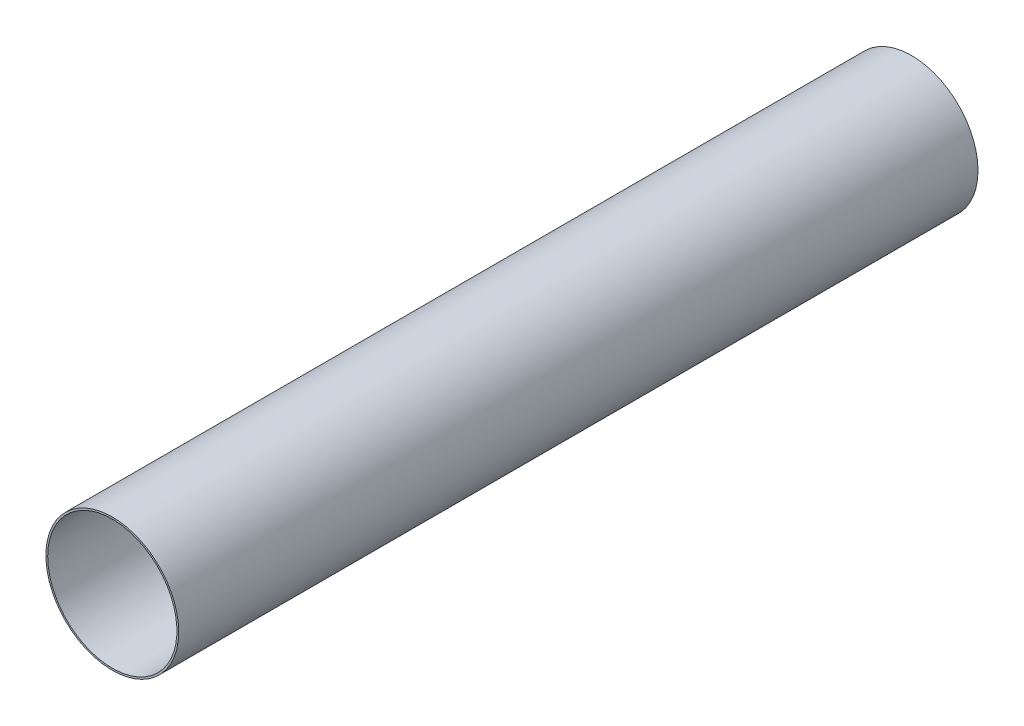
ISO-10303-21;
HEADER;
FILE_DESCRIPTION(('STEP AP214'),'2;1');
FILE_NAME('part.step','',(''),(''),'','','');
FILE_SCHEMA(('AUTOMOTIVE_DESIGN { 1 0 10303 214 1 1 1 1 }'));
ENDSEC;
DATA;
#1=APPLICATION_CONTEXT('core data for automotive mechanical design processes');
#2=APPLICATION_PROTOCOL_DEFINITION('international standard','automotive_design',2000,#1);
#3=PRODUCT_CONTEXT('',#1,'mechanical');
#4=PRODUCT('Part','Part','',(#3));
#5=PRODUCT_RELATED_PRODUCT_CATEGORY('part','',(#4));
#6=PRODUCT_DEFINITION_FORMATION('','',#4);
#7=PRODUCT_DEFINITION_CONTEXT('part definition',#1,'design');
#8=PRODUCT_DEFINITION('design','',#6,#7);
#9=PRODUCT_DEFINITION_SHAPE('','',#8);
#10=(LENGTH_UNIT() NAMED_UNIT(*) SI_UNIT(.MILLI.,.METRE.));
#11=(NAMED_UNIT(*) PLANE_ANGLE_UNIT() SI_UNIT($,.RADIAN.));
#12=(NAMED_UNIT(*) SI_UNIT($,.STERADIAN.) SOLID_ANGLE_UNIT());
#13=UNCERTAINTY_MEASURE_WITH_UNIT(LENGTH_MEASURE(1.E-05),#10,'distance_accuracy_value','');
#14=(GEOMETRIC_REPRESENTATION_CONTEXT(3) GLOBAL_UNCERTAINTY_ASSIGNED_CONTEXT((#13)) GLOBAL_UNIT_ASSIGNED_CONTEXT((#10,
#11,#12)) REPRESENTATION_CONTEXT('',''));
#15=CARTESIAN_POINT('',(0.,0.,0.));
#16=DIRECTION('',(0.,0.,1.));
#17=DIRECTION('',(1.,0.,0.));
#18=AXIS2_PLACEMENT_3D('',#15,#16,#17);
#19=CARTESIAN_POINT('',(0.,0.,561.6448));
#20=DIRECTION('',(0.,0.,-1.));
#21=DIRECTION('',(-1.,0.,0.));
#22=AXIS2_PLACEMENT_3D('',#19,#20,#21);
#23=CYLINDRICAL_SURFACE('',#22,46.6725);
#24=CARTESIAN_POINT('',(0.,0.,561.6448));
#25=DIRECTION('',(0.,0.,1.));
#26=DIRECTION('',(1.,0.,0.));
#27=AXIS2_PLACEMENT_3D('',#24,#25,#26);
#28=CIRCLE('',#27,46.6725);
#29=CARTESIAN_POINT('',(46.6725,0.,561.6448));
#30=VERTEX_POINT('',#29);
#31=EDGE_CURVE('E10',#30,#30,#28,.T.);
#32=ORIENTED_EDGE('',*,*,#31,.F.);
#33=EDGE_LOOP('',(#32));
#34=FACE_BOUND('',#33,.T.);
#35=CARTESIAN_POINT('',(0.,0.,0.));
#36=DIRECTION('',(0.,0.,1.));
#37=DIRECTION('',(1.,0.,0.));
#38=AXIS2_PLACEMENT_3D('',#35,#36,#37);
#39=CIRCLE('',#38,46.6725);
#40=CARTESIAN_POINT('',(46.6725,0.,0.));
#41=VERTEX_POINT('',#40);
#42=EDGE_CURVE('E34',#41,#41,#39,.T.);
#43=ORIENTED_EDGE('',*,*,#42,.T.);
#44=EDGE_LOOP('',(#43));
#45=FACE_BOUND('',#44,.T.);
#46=ADVANCED_FACE('F31',(#34,#45),#23,.T.);
#47=CARTESIAN_POINT('',(0.,0.,561.6448));
#48=DIRECTION('',(0.,0.,1.));
#49=DIRECTION('',(1.,0.,0.));
#50=AXIS2_PLACEMENT_3D('',#47,#48,#49);
#51=PLANE('',#50);
#52=CARTESIAN_POINT('',(0.,0.,561.6448));
#53=DIRECTION('',(0.,0.,-1.));
#54=DIRECTION('',(-1.,0.,0.));
#55=AXIS2_PLACEMENT_3D('',#52,#53,#54);
#56=CIRCLE('',#55,45.4025);
#57=CARTESIAN_POINT('',(-45.4025,0.,561.6448));
#58=VERTEX_POINT('',#57);
#59=EDGE_CURVE('E41',#58,#58,#56,.T.);
#60=ORIENTED_EDGE('',*,*,#59,.T.);
#61=EDGE_LOOP('',(#60));
#62=FACE_BOUND('',#61,.T.);
#63=ORIENTED_EDGE('',*,*,#31,.T.);
#64=EDGE_LOOP('',(#63));
#65=FACE_BOUND('',#64,.T.);
#66=ADVANCED_FACE('F49',(#62,#65),#51,.T.);
#67=CARTESIAN_POINT('',(0.,0.,0.));
#68=DIRECTION('',(0.,0.,1.));
#69=DIRECTION('',(1.,0.,0.));
#70=AXIS2_PLACEMENT_3D('',#67,#68,#69);
#71=PLANE('',#70);
#72=CARTESIAN_POINT('',(0.,0.,0.));
#73=DIRECTION('',(0.,0.,-1.));
#74=DIRECTION('',(-1.,0.,0.));
#75=AXIS2_PLACEMENT_3D('',#72,#73,#74);
#76=CIRCLE('',#75,45.4025);
#77=CARTESIAN_POINT('',(-45.4025,0.,0.));
#78=VERTEX_POINT('',#77);
#79=EDGE_CURVE('E43',#78,#78,#76,.T.);
#80=ORIENTED_EDGE('',*,*,#79,.F.);
#81=EDGE_LOOP('',(#80));
#82=FACE_BOUND('',#81,.T.);
#83=ORIENTED_EDGE('',*,*,#42,.F.);
#84=EDGE_LOOP('',(#83));
#85=FACE_BOUND('',#84,.T.);
#86=ADVANCED_FACE('F54',(#82,#85),#71,.F.);
#87=CARTESIAN_POINT('',(0.,0.,561.6448));
#88=DIRECTION('',(0.,0.,-1.));
#89=DIRECTION('',(-1.,0.,0.));
#90=AXIS2_PLACEMENT_3D('',#87,#88,#89);
#91=CYLINDRICAL_SURFACE('',#90,45.4025);
#92=ORIENTED_EDGE('',*,*,#59,.F.);
#93=EDGE_LOOP('',(#92));
#94=FACE_BOUND('',#93,.T.);
#95=ORIENTED_EDGE('',*,*,#79,.T.);
#96=EDGE_LOOP('',(#95));
#97=FACE_BOUND('',#96,.T.);
#98=ADVANCED_FACE('F51',(#94,#97),#91,.F.);
#99=CLOSED_SHELL('',(#46,#66,#86,#98));
#100=MANIFOLD_SOLID_BREP('B2',#99);
#101=ADVANCED_BREP_SHAPE_REPRESENTATION('',(#18,#100),#14);
#102=SHAPE_DEFINITION_REPRESENTATION(#9,#101);
ENDSEC;
END-ISO-10303-21;
